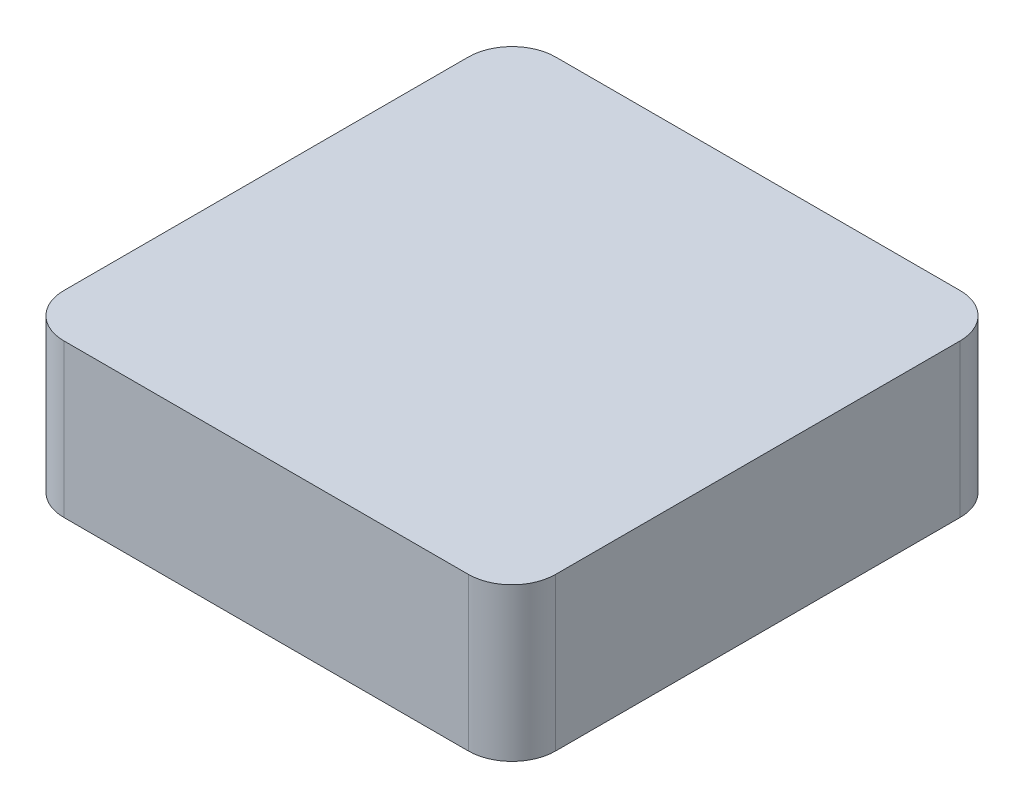
ISO-10303-21;
HEADER;
FILE_DESCRIPTION(('STEP AP214'),'2;1');
FILE_NAME('part.step','',(''),(''),'','','');
FILE_SCHEMA(('AUTOMOTIVE_DESIGN { 1 0 10303 214 1 1 1 1 }'));
ENDSEC;
DATA;
#1=APPLICATION_CONTEXT('core data for automotive mechanical design processes');
#2=APPLICATION_PROTOCOL_DEFINITION('international standard','automotive_design',2000,#1);
#3=PRODUCT_CONTEXT('',#1,'mechanical');
#4=PRODUCT('Part','Part','',(#3));
#5=PRODUCT_RELATED_PRODUCT_CATEGORY('part','',(#4));
#6=PRODUCT_DEFINITION_FORMATION('','',#4);
#7=PRODUCT_DEFINITION_CONTEXT('part definition',#1,'design');
#8=PRODUCT_DEFINITION('design','',#6,#7);
#9=PRODUCT_DEFINITION_SHAPE('','',#8);
#10=(LENGTH_UNIT() NAMED_UNIT(*) SI_UNIT(.MILLI.,.METRE.));
#11=(NAMED_UNIT(*) PLANE_ANGLE_UNIT() SI_UNIT($,.RADIAN.));
#12=(NAMED_UNIT(*) SI_UNIT($,.STERADIAN.) SOLID_ANGLE_UNIT());
#13=UNCERTAINTY_MEASURE_WITH_UNIT(LENGTH_MEASURE(1.E-05),#10,'distance_accuracy_value','');
#14=(GEOMETRIC_REPRESENTATION_CONTEXT(3) GLOBAL_UNCERTAINTY_ASSIGNED_CONTEXT((#13)) GLOBAL_UNIT_ASSIGNED_CONTEXT((#10,
#11,#12)) REPRESENTATION_CONTEXT('',''));
#15=CARTESIAN_POINT('',(0.,0.,0.));
#16=DIRECTION('',(0.,0.,1.));
#17=DIRECTION('',(1.,0.,0.));
#18=AXIS2_PLACEMENT_3D('',#15,#16,#17);
#19=CARTESIAN_POINT('',(22.5,7.,22.5));
#20=DIRECTION('',(-1.,0.,0.));
#21=DIRECTION('',(0.,0.,1.));
#22=AXIS2_PLACEMENT_3D('',#19,#20,#21);
#23=PLANE('',#22);
#24=DIRECTION('',(0.,0.,-1.));
#25=VECTOR('',#24,1.);
#26=CARTESIAN_POINT('',(22.5,-7.,22.5));
#27=LINE('',#26,#25);
#28=CARTESIAN_POINT('',(22.5,-7.,18.5));
#29=VERTEX_POINT('',#28);
#30=CARTESIAN_POINT('',(22.5,-7.,-18.5));
#31=VERTEX_POINT('',#30);
#32=EDGE_CURVE('E128',#29,#31,#27,.T.);
#33=ORIENTED_EDGE('',*,*,#32,.T.);
#34=DIRECTION('',(0.,-1.,0.));
#35=VECTOR('',#34,1.);
#36=CARTESIAN_POINT('',(22.5,7.,-18.5));
#37=LINE('',#36,#35);
#38=CARTESIAN_POINT('',(22.5,7.,-18.5));
#39=VERTEX_POINT('',#38);
#40=EDGE_CURVE('E151',#31,#39,#37,.F.);
#41=ORIENTED_EDGE('',*,*,#40,.T.);
#42=DIRECTION('',(0.,0.,-1.));
#43=VECTOR('',#42,1.);
#44=CARTESIAN_POINT('',(22.5,7.,22.5));
#45=LINE('',#44,#43);
#46=CARTESIAN_POINT('',(22.5,7.,18.5));
#47=VERTEX_POINT('',#46);
#48=EDGE_CURVE('E126',#47,#39,#45,.T.);
#49=ORIENTED_EDGE('',*,*,#48,.F.);
#50=DIRECTION('',(0.,-1.,0.));
#51=VECTOR('',#50,1.);
#52=CARTESIAN_POINT('',(22.5,7.,18.5));
#53=LINE('',#52,#51);
#54=EDGE_CURVE('E148',#47,#29,#53,.T.);
#55=ORIENTED_EDGE('',*,*,#54,.T.);
#56=EDGE_LOOP('',(#33,#41,#49,#55));
#57=FACE_BOUND('',#56,.T.);
#58=ADVANCED_FACE('F33',(#57),#23,.F.);
#59=CARTESIAN_POINT('',(-22.5,7.,-22.5));
#60=DIRECTION('',(0.,0.,1.));
#61=DIRECTION('',(1.,0.,0.));
#62=AXIS2_PLACEMENT_3D('',#59,#60,#61);
#63=PLANE('',#62);
#64=DIRECTION('',(-1.,0.,0.));
#65=VECTOR('',#64,1.);
#66=CARTESIAN_POINT('',(-22.5,-7.,-22.5));
#67=LINE('',#66,#65);
#68=CARTESIAN_POINT('',(18.5,-7.,-22.5));
#69=VERTEX_POINT('',#68);
#70=CARTESIAN_POINT('',(-18.5,-7.,-22.5));
#71=VERTEX_POINT('',#70);
#72=EDGE_CURVE('E124',#69,#71,#67,.T.);
#73=ORIENTED_EDGE('',*,*,#72,.T.);
#74=DIRECTION('',(0.,-1.,0.));
#75=VECTOR('',#74,1.);
#76=CARTESIAN_POINT('',(-18.5,7.,-22.5));
#77=LINE('',#76,#75);
#78=CARTESIAN_POINT('',(-18.5,7.,-22.5));
#79=VERTEX_POINT('',#78);
#80=EDGE_CURVE('E103',#71,#79,#77,.F.);
#81=ORIENTED_EDGE('',*,*,#80,.T.);
#82=DIRECTION('',(-1.,0.,0.));
#83=VECTOR('',#82,1.);
#84=CARTESIAN_POINT('',(-22.5,7.,-22.5));
#85=LINE('',#84,#83);
#86=CARTESIAN_POINT('',(18.5,7.,-22.5));
#87=VERTEX_POINT('',#86);
#88=EDGE_CURVE('E167',#87,#79,#85,.T.);
#89=ORIENTED_EDGE('',*,*,#88,.F.);
#90=DIRECTION('',(0.,-1.,0.));
#91=VECTOR('',#90,1.);
#92=CARTESIAN_POINT('',(18.5,7.,-22.5));
#93=LINE('',#92,#91);
#94=EDGE_CURVE('E108',#87,#69,#93,.T.);
#95=ORIENTED_EDGE('',*,*,#94,.T.);
#96=EDGE_LOOP('',(#73,#81,#89,#95));
#97=FACE_BOUND('',#96,.T.);
#98=ADVANCED_FACE('F184',(#97),#63,.F.);
#99=CARTESIAN_POINT('',(-22.5,7.,22.5));
#100=DIRECTION('',(1.,0.,0.));
#101=DIRECTION('',(0.,0.,-1.));
#102=AXIS2_PLACEMENT_3D('',#99,#100,#101);
#103=PLANE('',#102);
#104=DIRECTION('',(0.,0.,1.));
#105=VECTOR('',#104,1.);
#106=CARTESIAN_POINT('',(-22.5,7.,22.5));
#107=LINE('',#106,#105);
#108=CARTESIAN_POINT('',(-22.5,7.,-18.5));
#109=VERTEX_POINT('',#108);
#110=CARTESIAN_POINT('',(-22.5,7.,18.5));
#111=VERTEX_POINT('',#110);
#112=EDGE_CURVE('E117',#109,#111,#107,.T.);
#113=ORIENTED_EDGE('',*,*,#112,.F.);
#114=DIRECTION('',(0.,-1.,0.));
#115=VECTOR('',#114,1.);
#116=CARTESIAN_POINT('',(-22.5,7.,-18.5));
#117=LINE('',#116,#115);
#118=CARTESIAN_POINT('',(-22.5,-7.,-18.5));
#119=VERTEX_POINT('',#118);
#120=EDGE_CURVE('E102',#109,#119,#117,.T.);
#121=ORIENTED_EDGE('',*,*,#120,.T.);
#122=DIRECTION('',(0.,0.,1.));
#123=VECTOR('',#122,1.);
#124=CARTESIAN_POINT('',(-22.5,-7.,22.5));
#125=LINE('',#124,#123);
#126=CARTESIAN_POINT('',(-22.5,-7.,18.5));
#127=VERTEX_POINT('',#126);
#128=EDGE_CURVE('E115',#119,#127,#125,.T.);
#129=ORIENTED_EDGE('',*,*,#128,.T.);
#130=DIRECTION('',(0.,-1.,0.));
#131=VECTOR('',#130,1.);
#132=CARTESIAN_POINT('',(-22.5,7.,18.5));
#133=LINE('',#132,#131);
#134=EDGE_CURVE('E119',#127,#111,#133,.F.);
#135=ORIENTED_EDGE('',*,*,#134,.T.);
#136=EDGE_LOOP('',(#113,#121,#129,#135));
#137=FACE_BOUND('',#136,.T.);
#138=ADVANCED_FACE('F114',(#137),#103,.F.);
#139=CARTESIAN_POINT('',(-22.5,7.,22.5));
#140=DIRECTION('',(0.,0.,-1.));
#141=DIRECTION('',(-1.,0.,0.));
#142=AXIS2_PLACEMENT_3D('',#139,#140,#141);
#143=PLANE('',#142);
#144=DIRECTION('',(1.,0.,0.));
#145=VECTOR('',#144,1.);
#146=CARTESIAN_POINT('',(-22.5,-7.,22.5));
#147=LINE('',#146,#145);
#148=CARTESIAN_POINT('',(-18.5,-7.,22.5));
#149=VERTEX_POINT('',#148);
#150=CARTESIAN_POINT('',(18.5,-7.,22.5));
#151=VERTEX_POINT('',#150);
#152=EDGE_CURVE('E123',#149,#151,#147,.T.);
#153=ORIENTED_EDGE('',*,*,#152,.T.);
#154=DIRECTION('',(0.,-1.,0.));
#155=VECTOR('',#154,1.);
#156=CARTESIAN_POINT('',(18.5,7.,22.5));
#157=LINE('',#156,#155);
#158=CARTESIAN_POINT('',(18.5,7.,22.5));
#159=VERTEX_POINT('',#158);
#160=EDGE_CURVE('E11',#151,#159,#157,.F.);
#161=ORIENTED_EDGE('',*,*,#160,.T.);
#162=DIRECTION('',(1.,0.,0.));
#163=VECTOR('',#162,1.);
#164=CARTESIAN_POINT('',(-22.5,7.,22.5));
#165=LINE('',#164,#163);
#166=CARTESIAN_POINT('',(-18.5,7.,22.5));
#167=VERTEX_POINT('',#166);
#168=EDGE_CURVE('E132',#167,#159,#165,.T.);
#169=ORIENTED_EDGE('',*,*,#168,.F.);
#170=DIRECTION('',(0.,-1.,0.));
#171=VECTOR('',#170,1.);
#172=CARTESIAN_POINT('',(-18.5,7.,22.5));
#173=LINE('',#172,#171);
#174=EDGE_CURVE('E41',#167,#149,#173,.T.);
#175=ORIENTED_EDGE('',*,*,#174,.T.);
#176=EDGE_LOOP('',(#153,#161,#169,#175));
#177=FACE_BOUND('',#176,.T.);
#178=ADVANCED_FACE('F154',(#177),#143,.F.);
#179=CARTESIAN_POINT('',(0.,7.,0.));
#180=DIRECTION('',(0.,-1.,0.));
#181=DIRECTION('',(0.,0.,-1.));
#182=AXIS2_PLACEMENT_3D('',#179,#180,#181);
#183=PLANE('',#182);
#184=ORIENTED_EDGE('',*,*,#88,.T.);
#185=CARTESIAN_POINT('',(-18.5,7.,-18.5));
#186=DIRECTION('',(0.,-1.,0.));
#187=DIRECTION('',(0.,0.,-1.));
#188=AXIS2_PLACEMENT_3D('',#185,#186,#187);
#189=CIRCLE('',#188,4.);
#190=EDGE_CURVE('E146',#79,#109,#189,.F.);
#191=ORIENTED_EDGE('',*,*,#190,.T.);
#192=ORIENTED_EDGE('',*,*,#112,.T.);
#193=CARTESIAN_POINT('',(-18.5,7.,18.5));
#194=DIRECTION('',(0.,-1.,0.));
#195=DIRECTION('',(0.,0.,-1.));
#196=AXIS2_PLACEMENT_3D('',#193,#194,#195);
#197=CIRCLE('',#196,4.);
#198=EDGE_CURVE('E53',#111,#167,#197,.F.);
#199=ORIENTED_EDGE('',*,*,#198,.T.);
#200=ORIENTED_EDGE('',*,*,#168,.T.);
#201=CARTESIAN_POINT('',(18.5,7.,18.5));
#202=DIRECTION('',(0.,-1.,0.));
#203=DIRECTION('',(0.,0.,-1.));
#204=AXIS2_PLACEMENT_3D('',#201,#202,#203);
#205=CIRCLE('',#204,4.);
#206=EDGE_CURVE('E142',#159,#47,#205,.F.);
#207=ORIENTED_EDGE('',*,*,#206,.T.);
#208=ORIENTED_EDGE('',*,*,#48,.T.);
#209=CARTESIAN_POINT('',(18.5,7.,-18.5));
#210=DIRECTION('',(0.,-1.,0.));
#211=DIRECTION('',(0.,0.,-1.));
#212=AXIS2_PLACEMENT_3D('',#209,#210,#211);
#213=CIRCLE('',#212,4.);
#214=EDGE_CURVE('E144',#39,#87,#213,.F.);
#215=ORIENTED_EDGE('',*,*,#214,.T.);
#216=EDGE_LOOP('',(#184,#191,#192,#199,#200,#207,#208,#215));
#217=FACE_BOUND('',#216,.T.);
#218=ADVANCED_FACE('F173',(#217),#183,.F.);
#219=CARTESIAN_POINT('',(0.,-7.,0.));
#220=DIRECTION('',(0.,-1.,0.));
#221=DIRECTION('',(0.,0.,-1.));
#222=AXIS2_PLACEMENT_3D('',#219,#220,#221);
#223=PLANE('',#222);
#224=ORIENTED_EDGE('',*,*,#128,.F.);
#225=CARTESIAN_POINT('',(-18.5,-7.,-18.5));
#226=DIRECTION('',(0.,-1.,0.));
#227=DIRECTION('',(0.,0.,-1.));
#228=AXIS2_PLACEMENT_3D('',#225,#226,#227);
#229=CIRCLE('',#228,4.);
#230=EDGE_CURVE('E98',#119,#71,#229,.T.);
#231=ORIENTED_EDGE('',*,*,#230,.T.);
#232=ORIENTED_EDGE('',*,*,#72,.F.);
#233=CARTESIAN_POINT('',(18.5,-7.,-18.5));
#234=DIRECTION('',(0.,-1.,0.));
#235=DIRECTION('',(0.,0.,-1.));
#236=AXIS2_PLACEMENT_3D('',#233,#234,#235);
#237=CIRCLE('',#236,4.);
#238=EDGE_CURVE('E109',#69,#31,#237,.T.);
#239=ORIENTED_EDGE('',*,*,#238,.T.);
#240=ORIENTED_EDGE('',*,*,#32,.F.);
#241=CARTESIAN_POINT('',(18.5,-7.,18.5));
#242=DIRECTION('',(0.,-1.,0.));
#243=DIRECTION('',(0.,0.,-1.));
#244=AXIS2_PLACEMENT_3D('',#241,#242,#243);
#245=CIRCLE('',#244,4.);
#246=EDGE_CURVE('E135',#29,#151,#245,.T.);
#247=ORIENTED_EDGE('',*,*,#246,.T.);
#248=ORIENTED_EDGE('',*,*,#152,.F.);
#249=CARTESIAN_POINT('',(-18.5,-7.,18.5));
#250=DIRECTION('',(0.,-1.,0.));
#251=DIRECTION('',(0.,0.,-1.));
#252=AXIS2_PLACEMENT_3D('',#249,#250,#251);
#253=CIRCLE('',#252,4.);
#254=EDGE_CURVE('E118',#149,#127,#253,.T.);
#255=ORIENTED_EDGE('',*,*,#254,.T.);
#256=EDGE_LOOP('',(#224,#231,#232,#239,#240,#247,#248,#255));
#257=FACE_BOUND('',#256,.T.);
#258=ADVANCED_FACE('F121',(#257),#223,.T.);
#259=CARTESIAN_POINT('',(-18.5,7.,-18.5));
#260=DIRECTION('',(0.,-1.,0.));
#261=DIRECTION('',(0.,0.,-1.));
#262=AXIS2_PLACEMENT_3D('',#259,#260,#261);
#263=CYLINDRICAL_SURFACE('',#262,4.);
#264=ORIENTED_EDGE('',*,*,#190,.F.);
#265=ORIENTED_EDGE('',*,*,#80,.F.);
#266=ORIENTED_EDGE('',*,*,#230,.F.);
#267=ORIENTED_EDGE('',*,*,#120,.F.);
#268=EDGE_LOOP('',(#264,#265,#266,#267));
#269=FACE_BOUND('',#268,.T.);
#270=ADVANCED_FACE('F101',(#269),#263,.T.);
#271=CARTESIAN_POINT('',(18.5,7.,-18.5));
#272=DIRECTION('',(0.,-1.,0.));
#273=DIRECTION('',(0.,0.,-1.));
#274=AXIS2_PLACEMENT_3D('',#271,#272,#273);
#275=CYLINDRICAL_SURFACE('',#274,4.);
#276=ORIENTED_EDGE('',*,*,#214,.F.);
#277=ORIENTED_EDGE('',*,*,#40,.F.);
#278=ORIENTED_EDGE('',*,*,#238,.F.);
#279=ORIENTED_EDGE('',*,*,#94,.F.);
#280=EDGE_LOOP('',(#276,#277,#278,#279));
#281=FACE_BOUND('',#280,.T.);
#282=ADVANCED_FACE('F195',(#281),#275,.T.);
#283=CARTESIAN_POINT('',(18.5,7.,18.5));
#284=DIRECTION('',(0.,-1.,0.));
#285=DIRECTION('',(0.,0.,-1.));
#286=AXIS2_PLACEMENT_3D('',#283,#284,#285);
#287=CYLINDRICAL_SURFACE('',#286,4.);
#288=ORIENTED_EDGE('',*,*,#206,.F.);
#289=ORIENTED_EDGE('',*,*,#160,.F.);
#290=ORIENTED_EDGE('',*,*,#246,.F.);
#291=ORIENTED_EDGE('',*,*,#54,.F.);
#292=EDGE_LOOP('',(#288,#289,#290,#291));
#293=FACE_BOUND('',#292,.T.);
#294=ADVANCED_FACE('F161',(#293),#287,.T.);
#295=CARTESIAN_POINT('',(-18.5,7.,18.5));
#296=DIRECTION('',(0.,-1.,0.));
#297=DIRECTION('',(0.,0.,-1.));
#298=AXIS2_PLACEMENT_3D('',#295,#296,#297);
#299=CYLINDRICAL_SURFACE('',#298,4.);
#300=ORIENTED_EDGE('',*,*,#198,.F.);
#301=ORIENTED_EDGE('',*,*,#134,.F.);
#302=ORIENTED_EDGE('',*,*,#254,.F.);
#303=ORIENTED_EDGE('',*,*,#174,.F.);
#304=EDGE_LOOP('',(#300,#301,#302,#303));
#305=FACE_BOUND('',#304,.T.);
#306=ADVANCED_FACE('F35',(#305),#299,.T.);
#307=CLOSED_SHELL('',(#58,#98,#138,#178,#218,#258,#270,#282,#294,#306));
#308=MANIFOLD_SOLID_BREP('B2',#307);
#309=ADVANCED_BREP_SHAPE_REPRESENTATION('',(#18,#308),#14);
#310=SHAPE_DEFINITION_REPRESENTATION(#9,#309);
ENDSEC;
END-ISO-10303-21;
